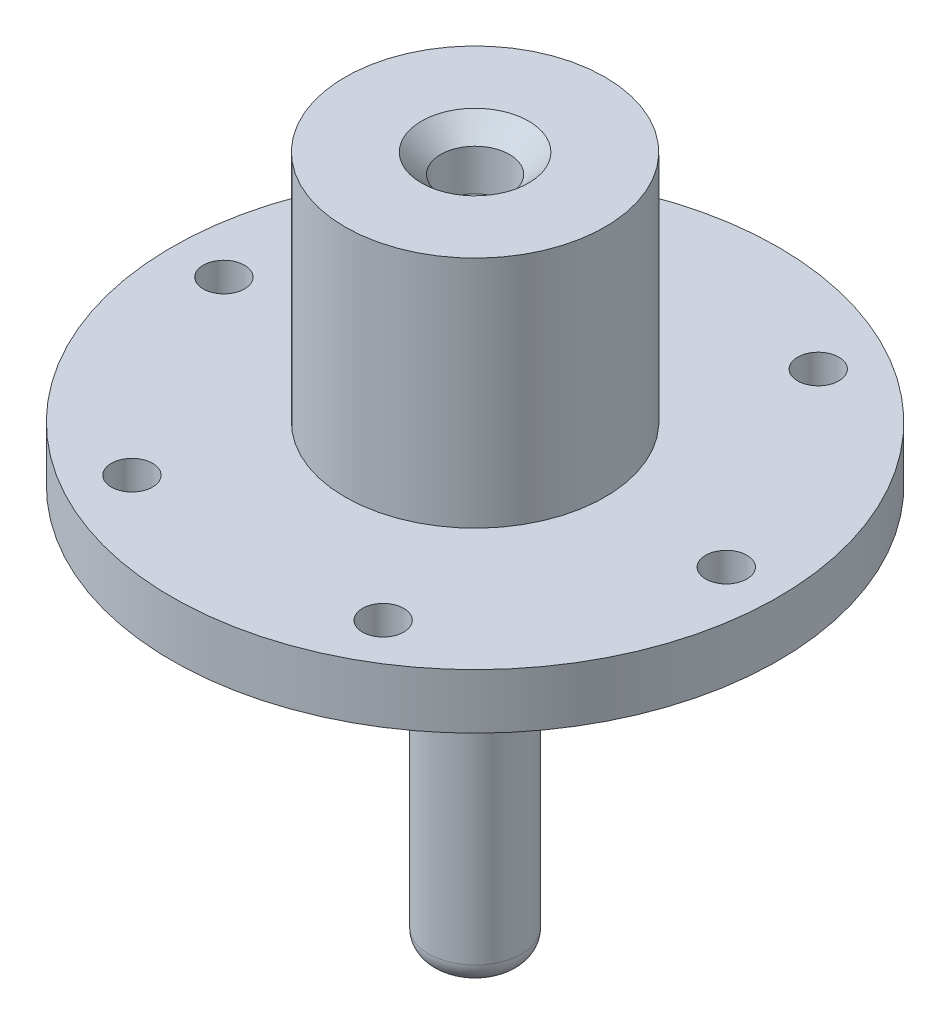
ISO-10303-21;
HEADER;
FILE_DESCRIPTION(('STEP AP214'),'2;1');
FILE_NAME('part.step','',(''),(''),'','','');
FILE_SCHEMA(('AUTOMOTIVE_DESIGN { 1 0 10303 214 1 1 1 1 }'));
ENDSEC;
DATA;
#1=APPLICATION_CONTEXT('core data for automotive mechanical design processes');
#2=APPLICATION_PROTOCOL_DEFINITION('international standard','automotive_design',2000,#1);
#3=PRODUCT_CONTEXT('',#1,'mechanical');
#4=PRODUCT('Part','Part','',(#3));
#5=PRODUCT_RELATED_PRODUCT_CATEGORY('part','',(#4));
#6=PRODUCT_DEFINITION_FORMATION('','',#4);
#7=PRODUCT_DEFINITION_CONTEXT('part definition',#1,'design');
#8=PRODUCT_DEFINITION('design','',#6,#7);
#9=PRODUCT_DEFINITION_SHAPE('','',#8);
#10=(LENGTH_UNIT() NAMED_UNIT(*) SI_UNIT(.MILLI.,.METRE.));
#11=(NAMED_UNIT(*) PLANE_ANGLE_UNIT() SI_UNIT($,.RADIAN.));
#12=(NAMED_UNIT(*) SI_UNIT($,.STERADIAN.) SOLID_ANGLE_UNIT());
#13=UNCERTAINTY_MEASURE_WITH_UNIT(LENGTH_MEASURE(1.E-05),#10,'distance_accuracy_value','');
#14=(GEOMETRIC_REPRESENTATION_CONTEXT(3) GLOBAL_UNCERTAINTY_ASSIGNED_CONTEXT((#13)) GLOBAL_UNIT_ASSIGNED_CONTEXT((#10,
#11,#12)) REPRESENTATION_CONTEXT('',''));
#15=CARTESIAN_POINT('',(0.,0.,0.));
#16=DIRECTION('',(0.,0.,1.));
#17=DIRECTION('',(1.,0.,0.));
#18=AXIS2_PLACEMENT_3D('',#15,#16,#17);
#19=CARTESIAN_POINT('',(-15.,-27.,0.));
#20=DIRECTION('',(0.,-1.,0.));
#21=DIRECTION('',(0.,0.,-1.));
#22=AXIS2_PLACEMENT_3D('',#19,#20,#21);
#23=PLANE('',#22);
#24=CARTESIAN_POINT('',(-14.4999999999998,-27.,25.1147367097489));
#25=DIRECTION('',(0.,1.,0.));
#26=DIRECTION('',(0.,0.,1.));
#27=AXIS2_PLACEMENT_3D('',#24,#25,#26);
#28=CIRCLE('',#27,2.38124999999999);
#29=CARTESIAN_POINT('',(-14.4999999999998,-27.,27.4959867097488));
#30=VERTEX_POINT('',#29);
#31=EDGE_CURVE('E132',#30,#30,#28,.T.);
#32=ORIENTED_EDGE('',*,*,#31,.F.);
#33=EDGE_LOOP('',(#32));
#34=FACE_BOUND('',#33,.T.);
#35=CARTESIAN_POINT('',(-29.,-27.,0.));
#36=DIRECTION('',(0.,1.,0.));
#37=DIRECTION('',(0.,0.,1.));
#38=AXIS2_PLACEMENT_3D('',#35,#36,#37);
#39=CIRCLE('',#38,2.38124999999999);
#40=CARTESIAN_POINT('',(-29.,-27.,2.38124999999999));
#41=VERTEX_POINT('',#40);
#42=EDGE_CURVE('E118',#41,#41,#39,.T.);
#43=ORIENTED_EDGE('',*,*,#42,.F.);
#44=EDGE_LOOP('',(#43));
#45=FACE_BOUND('',#44,.T.);
#46=CARTESIAN_POINT('',(-14.5000000000001,-27.,-25.1147367097487));
#47=DIRECTION('',(0.,1.,0.));
#48=DIRECTION('',(0.,0.,1.));
#49=AXIS2_PLACEMENT_3D('',#46,#47,#48);
#50=CIRCLE('',#49,2.38124999999999);
#51=CARTESIAN_POINT('',(-14.5000000000001,-27.,-22.7334867097487));
#52=VERTEX_POINT('',#51);
#53=EDGE_CURVE('E114',#52,#52,#50,.T.);
#54=ORIENTED_EDGE('',*,*,#53,.F.);
#55=EDGE_LOOP('',(#54));
#56=FACE_BOUND('',#55,.T.);
#57=CARTESIAN_POINT('',(14.4999999999999,-27.,-25.1147367097488));
#58=DIRECTION('',(0.,1.,0.));
#59=DIRECTION('',(0.,0.,1.));
#60=AXIS2_PLACEMENT_3D('',#57,#58,#59);
#61=CIRCLE('',#60,2.38124999999999);
#62=CARTESIAN_POINT('',(14.4999999999999,-27.,-22.7334867097488));
#63=VERTEX_POINT('',#62);
#64=EDGE_CURVE('E110',#63,#63,#61,.T.);
#65=ORIENTED_EDGE('',*,*,#64,.F.);
#66=EDGE_LOOP('',(#65));
#67=FACE_BOUND('',#66,.T.);
#68=CARTESIAN_POINT('',(29.,-27.,0.));
#69=DIRECTION('',(0.,1.,0.));
#70=DIRECTION('',(0.,0.,1.));
#71=AXIS2_PLACEMENT_3D('',#68,#69,#70);
#72=CIRCLE('',#71,2.38124999999998);
#73=CARTESIAN_POINT('',(29.,-27.,2.38124999999998));
#74=VERTEX_POINT('',#73);
#75=EDGE_CURVE('E109',#74,#74,#72,.T.);
#76=ORIENTED_EDGE('',*,*,#75,.F.);
#77=EDGE_LOOP('',(#76));
#78=FACE_BOUND('',#77,.T.);
#79=CARTESIAN_POINT('',(0.,-27.,0.));
#80=DIRECTION('',(0.,-1.,0.));
#81=DIRECTION('',(0.,0.,-1.));
#82=AXIS2_PLACEMENT_3D('',#79,#80,#81);
#83=CIRCLE('',#82,35.);
#84=CARTESIAN_POINT('',(0.,-27.,-35.));
#85=VERTEX_POINT('',#84);
#86=EDGE_CURVE('E98',#85,#85,#83,.T.);
#87=ORIENTED_EDGE('',*,*,#86,.F.);
#88=EDGE_LOOP('',(#87));
#89=FACE_BOUND('',#88,.T.);
#90=CARTESIAN_POINT('',(0.,-27.,0.));
#91=DIRECTION('',(0.,-1.,0.));
#92=DIRECTION('',(0.,0.,-1.));
#93=AXIS2_PLACEMENT_3D('',#90,#91,#92);
#94=CIRCLE('',#93,15.);
#95=CARTESIAN_POINT('',(0.,-27.,-15.));
#96=VERTEX_POINT('',#95);
#97=EDGE_CURVE('E47',#96,#96,#94,.T.);
#98=ORIENTED_EDGE('',*,*,#97,.T.);
#99=EDGE_LOOP('',(#98));
#100=FACE_BOUND('',#99,.T.);
#101=CARTESIAN_POINT('',(14.5000000000003,-27.,25.1147367097486));
#102=DIRECTION('',(0.,1.,0.));
#103=DIRECTION('',(0.,0.,1.));
#104=AXIS2_PLACEMENT_3D('',#101,#102,#103);
#105=CIRCLE('',#104,2.38124999999999);
#106=CARTESIAN_POINT('',(14.5000000000003,-27.,27.4959867097485));
#107=VERTEX_POINT('',#106);
#108=EDGE_CURVE('E281',#107,#107,#105,.T.);
#109=ORIENTED_EDGE('',*,*,#108,.F.);
#110=EDGE_LOOP('',(#109));
#111=FACE_BOUND('',#110,.T.);
#112=ADVANCED_FACE('F38',(#34,#45,#56,#67,#78,#89,#100,#111),#23,.F.);
#113=CARTESIAN_POINT('',(0.,0.,0.));
#114=DIRECTION('',(0.,-1.,0.));
#115=DIRECTION('',(0.,0.,-1.));
#116=AXIS2_PLACEMENT_3D('',#113,#114,#115);
#117=PLANE('',#116);
#118=CARTESIAN_POINT('',(0.,0.,0.));
#119=DIRECTION('',(0.,1.,0.));
#120=DIRECTION('',(0.,0.,1.));
#121=AXIS2_PLACEMENT_3D('',#118,#119,#120);
#122=CIRCLE('',#121,6.19125);
#123=CARTESIAN_POINT('',(0.,0.,6.19125));
#124=VERTEX_POINT('',#123);
#125=EDGE_CURVE('E159',#124,#124,#122,.T.);
#126=ORIENTED_EDGE('',*,*,#125,.F.);
#127=EDGE_LOOP('',(#126));
#128=FACE_BOUND('',#127,.T.);
#129=CARTESIAN_POINT('',(0.,0.,0.));
#130=DIRECTION('',(0.,-1.,0.));
#131=DIRECTION('',(0.,0.,-1.));
#132=AXIS2_PLACEMENT_3D('',#129,#130,#131);
#133=CIRCLE('',#132,15.);
#134=CARTESIAN_POINT('',(0.,0.,-15.));
#135=VERTEX_POINT('',#134);
#136=EDGE_CURVE('E11',#135,#135,#133,.T.);
#137=ORIENTED_EDGE('',*,*,#136,.F.);
#138=EDGE_LOOP('',(#137));
#139=FACE_BOUND('',#138,.T.);
#140=ADVANCED_FACE('F40',(#128,#139),#117,.F.);
#141=CARTESIAN_POINT('',(0.,-80.0033000000001,0.));
#142=DIRECTION('',(0.,-1.,0.));
#143=DIRECTION('',(0.,0.,-1.));
#144=AXIS2_PLACEMENT_3D('',#141,#142,#143);
#145=CYLINDRICAL_SURFACE('',#144,15.);
#146=ORIENTED_EDGE('',*,*,#97,.F.);
#147=EDGE_LOOP('',(#146));
#148=FACE_BOUND('',#147,.T.);
#149=ORIENTED_EDGE('',*,*,#136,.T.);
#150=EDGE_LOOP('',(#149));
#151=FACE_BOUND('',#150,.T.);
#152=ADVANCED_FACE('F190',(#148,#151),#145,.T.);
#153=CARTESIAN_POINT('',(0.,-80.0033000000001,0.));
#154=DIRECTION('',(0.,-1.,0.));
#155=DIRECTION('',(0.,0.,-1.));
#156=AXIS2_PLACEMENT_3D('',#153,#154,#155);
#157=CYLINDRICAL_SURFACE('',#156,35.);
#158=CARTESIAN_POINT('',(0.,-33.35,0.));
#159=DIRECTION('',(0.,-1.,0.));
#160=DIRECTION('',(0.,0.,-1.));
#161=AXIS2_PLACEMENT_3D('',#158,#159,#160);
#162=CIRCLE('',#161,35.);
#163=CARTESIAN_POINT('',(0.,-33.35,-35.));
#164=VERTEX_POINT('',#163);
#165=EDGE_CURVE('E94',#164,#164,#162,.T.);
#166=ORIENTED_EDGE('',*,*,#165,.F.);
#167=EDGE_LOOP('',(#166));
#168=FACE_BOUND('',#167,.T.);
#169=ORIENTED_EDGE('',*,*,#86,.T.);
#170=EDGE_LOOP('',(#169));
#171=FACE_BOUND('',#170,.T.);
#172=ADVANCED_FACE('F194',(#168,#171),#157,.T.);
#173=CARTESIAN_POINT('',(-35.,-33.35,0.));
#174=DIRECTION('',(0.,1.,0.));
#175=DIRECTION('',(0.,0.,1.));
#176=AXIS2_PLACEMENT_3D('',#173,#174,#175);
#177=PLANE('',#176);
#178=CARTESIAN_POINT('',(14.5000000000003,-33.35,25.1147367097486));
#179=DIRECTION('',(0.,1.,0.));
#180=DIRECTION('',(0.,0.,1.));
#181=AXIS2_PLACEMENT_3D('',#178,#179,#180);
#182=CIRCLE('',#181,2.38124999999999);
#183=CARTESIAN_POINT('',(14.5000000000003,-33.35,27.4959867097485));
#184=VERTEX_POINT('',#183);
#185=EDGE_CURVE('E42',#184,#184,#182,.T.);
#186=ORIENTED_EDGE('',*,*,#185,.T.);
#187=EDGE_LOOP('',(#186));
#188=FACE_BOUND('',#187,.T.);
#189=CARTESIAN_POINT('',(-14.4999999999998,-33.35,25.1147367097489));
#190=DIRECTION('',(0.,1.,0.));
#191=DIRECTION('',(0.,0.,1.));
#192=AXIS2_PLACEMENT_3D('',#189,#190,#191);
#193=CIRCLE('',#192,2.38124999999999);
#194=CARTESIAN_POINT('',(-14.4999999999998,-33.35,27.4959867097488));
#195=VERTEX_POINT('',#194);
#196=EDGE_CURVE('E126',#195,#195,#193,.T.);
#197=ORIENTED_EDGE('',*,*,#196,.T.);
#198=EDGE_LOOP('',(#197));
#199=FACE_BOUND('',#198,.T.);
#200=CARTESIAN_POINT('',(-29.,-33.35,0.));
#201=DIRECTION('',(0.,1.,0.));
#202=DIRECTION('',(0.,0.,1.));
#203=AXIS2_PLACEMENT_3D('',#200,#201,#202);
#204=CIRCLE('',#203,2.38124999999999);
#205=CARTESIAN_POINT('',(-29.,-33.35,2.38124999999999));
#206=VERTEX_POINT('',#205);
#207=EDGE_CURVE('E115',#206,#206,#204,.T.);
#208=ORIENTED_EDGE('',*,*,#207,.T.);
#209=EDGE_LOOP('',(#208));
#210=FACE_BOUND('',#209,.T.);
#211=CARTESIAN_POINT('',(-14.5000000000001,-33.35,-25.1147367097487));
#212=DIRECTION('',(0.,1.,0.));
#213=DIRECTION('',(0.,0.,1.));
#214=AXIS2_PLACEMENT_3D('',#211,#212,#213);
#215=CIRCLE('',#214,2.38124999999999);
#216=CARTESIAN_POINT('',(-14.5000000000001,-33.35,-22.7334867097487));
#217=VERTEX_POINT('',#216);
#218=EDGE_CURVE('E111',#217,#217,#215,.T.);
#219=ORIENTED_EDGE('',*,*,#218,.T.);
#220=EDGE_LOOP('',(#219));
#221=FACE_BOUND('',#220,.T.);
#222=CARTESIAN_POINT('',(14.4999999999999,-33.35,-25.1147367097488));
#223=DIRECTION('',(0.,1.,0.));
#224=DIRECTION('',(0.,0.,1.));
#225=AXIS2_PLACEMENT_3D('',#222,#223,#224);
#226=CIRCLE('',#225,2.38124999999999);
#227=CARTESIAN_POINT('',(14.4999999999999,-33.35,-22.7334867097488));
#228=VERTEX_POINT('',#227);
#229=EDGE_CURVE('E105',#228,#228,#226,.T.);
#230=ORIENTED_EDGE('',*,*,#229,.T.);
#231=EDGE_LOOP('',(#230));
#232=FACE_BOUND('',#231,.T.);
#233=CARTESIAN_POINT('',(29.,-33.35,0.));
#234=DIRECTION('',(0.,1.,0.));
#235=DIRECTION('',(0.,0.,1.));
#236=AXIS2_PLACEMENT_3D('',#233,#234,#235);
#237=CIRCLE('',#236,2.38124999999998);
#238=CARTESIAN_POINT('',(29.,-33.35,2.38124999999998));
#239=VERTEX_POINT('',#238);
#240=EDGE_CURVE('E142',#239,#239,#237,.T.);
#241=ORIENTED_EDGE('',*,*,#240,.T.);
#242=EDGE_LOOP('',(#241));
#243=FACE_BOUND('',#242,.T.);
#244=CARTESIAN_POINT('',(0.,-33.35,0.));
#245=DIRECTION('',(0.,-1.,0.));
#246=DIRECTION('',(0.,0.,-1.));
#247=AXIS2_PLACEMENT_3D('',#244,#245,#246);
#248=CIRCLE('',#247,24.);
#249=CARTESIAN_POINT('',(0.,-33.35,-24.));
#250=VERTEX_POINT('',#249);
#251=EDGE_CURVE('E151',#250,#250,#248,.T.);
#252=ORIENTED_EDGE('',*,*,#251,.F.);
#253=EDGE_LOOP('',(#252));
#254=FACE_BOUND('',#253,.T.);
#255=ORIENTED_EDGE('',*,*,#165,.T.);
#256=EDGE_LOOP('',(#255));
#257=FACE_BOUND('',#256,.T.);
#258=ADVANCED_FACE('F55',(#188,#199,#210,#221,#232,#243,#254,#257),#177,.F.);
#259=CARTESIAN_POINT('',(0.,-77.,0.));
#260=DIRECTION('',(0.,1.,0.));
#261=DIRECTION('',(0.,0.,1.));
#262=AXIS2_PLACEMENT_3D('',#259,#260,#261);
#263=CONICAL_SURFACE('',#262,3.0734,1.02974425867665);
#264=CARTESIAN_POINT('',(0.,-78.8466850265193,0.));
#265=VERTEX_POINT('',#264);
#266=VERTEX_LOOP('',#265);
#267=FACE_BOUND('',#266,.T.);
#268=CARTESIAN_POINT('',(0.,-77.,0.));
#269=DIRECTION('',(0.,1.,0.));
#270=DIRECTION('',(0.,0.,1.));
#271=AXIS2_PLACEMENT_3D('',#268,#269,#270);
#272=CIRCLE('',#271,3.0734);
#273=CARTESIAN_POINT('',(0.,-77.,3.0734));
#274=VERTEX_POINT('',#273);
#275=EDGE_CURVE('E59',#274,#274,#272,.T.);
#276=ORIENTED_EDGE('',*,*,#275,.T.);
#277=EDGE_LOOP('',(#276));
#278=FACE_BOUND('',#277,.T.);
#279=ADVANCED_FACE('F51',(#267,#278),#263,.F.);
#280=CARTESIAN_POINT('',(0.,0.,0.));
#281=DIRECTION('',(0.,1.,0.));
#282=DIRECTION('',(0.,0.,1.));
#283=AXIS2_PLACEMENT_3D('',#280,#281,#282);
#284=CYLINDRICAL_SURFACE('',#283,3.0734);
#285=ORIENTED_EDGE('',*,*,#275,.F.);
#286=EDGE_LOOP('',(#285));
#287=FACE_BOUND('',#286,.T.);
#288=CARTESIAN_POINT('',(0.,-6.89,0.));
#289=DIRECTION('',(0.,1.,0.));
#290=DIRECTION('',(0.,0.,1.));
#291=AXIS2_PLACEMENT_3D('',#288,#289,#290);
#292=CIRCLE('',#291,3.07340000000001);
#293=CARTESIAN_POINT('',(0.,-6.89,3.07340000000001));
#294=VERTEX_POINT('',#293);
#295=EDGE_CURVE('E63',#294,#294,#292,.T.);
#296=ORIENTED_EDGE('',*,*,#295,.T.);
#297=EDGE_LOOP('',(#296));
#298=FACE_BOUND('',#297,.T.);
#299=ADVANCED_FACE('F54',(#287,#298),#284,.F.);
#300=CARTESIAN_POINT('',(3.07340000000001,-6.89,0.));
#301=DIRECTION('',(0.,-1.,0.));
#302=DIRECTION('',(0.,0.,-1.));
#303=AXIS2_PLACEMENT_3D('',#300,#301,#302);
#304=PLANE('',#303);
#305=ORIENTED_EDGE('',*,*,#295,.F.);
#306=EDGE_LOOP('',(#305));
#307=FACE_BOUND('',#306,.T.);
#308=CARTESIAN_POINT('',(0.,-6.89,0.));
#309=DIRECTION('',(0.,1.,0.));
#310=DIRECTION('',(0.,0.,1.));
#311=AXIS2_PLACEMENT_3D('',#308,#309,#310);
#312=CIRCLE('',#311,3.82912199687147);
#313=CARTESIAN_POINT('',(0.,-6.89,3.82912199687147));
#314=VERTEX_POINT('',#313);
#315=EDGE_CURVE('E71',#314,#314,#312,.T.);
#316=ORIENTED_EDGE('',*,*,#315,.T.);
#317=EDGE_LOOP('',(#316));
#318=FACE_BOUND('',#317,.T.);
#319=ADVANCED_FACE('F173',(#307,#318),#304,.F.);
#320=CARTESIAN_POINT('',(0.,-2.222373,0.));
#321=DIRECTION('',(0.,1.,0.));
#322=DIRECTION('',(0.,0.,1.));
#323=AXIS2_PLACEMENT_3D('',#320,#321,#322);
#324=CONICAL_SURFACE('',#323,3.968877,0.0299323966717035);
#325=ORIENTED_EDGE('',*,*,#315,.F.);
#326=EDGE_LOOP('',(#325));
#327=FACE_BOUND('',#326,.T.);
#328=CARTESIAN_POINT('',(0.,-2.222373,0.));
#329=DIRECTION('',(0.,1.,0.));
#330=DIRECTION('',(0.,0.,1.));
#331=AXIS2_PLACEMENT_3D('',#328,#329,#330);
#332=CIRCLE('',#331,3.968877);
#333=CARTESIAN_POINT('',(0.,-2.222373,3.968877));
#334=VERTEX_POINT('',#333);
#335=EDGE_CURVE('E166',#334,#334,#332,.T.);
#336=ORIENTED_EDGE('',*,*,#335,.T.);
#337=EDGE_LOOP('',(#336));
#338=FACE_BOUND('',#337,.T.);
#339=ADVANCED_FACE('F175',(#327,#338),#324,.F.);
#340=CARTESIAN_POINT('',(0.,0.,0.));
#341=DIRECTION('',(0.,1.,0.));
#342=DIRECTION('',(0.,0.,1.));
#343=AXIS2_PLACEMENT_3D('',#340,#341,#342);
#344=CONICAL_SURFACE('',#343,6.19125,0.785398163397449);
#345=ORIENTED_EDGE('',*,*,#335,.F.);
#346=EDGE_LOOP('',(#345));
#347=FACE_BOUND('',#346,.T.);
#348=ORIENTED_EDGE('',*,*,#125,.T.);
#349=EDGE_LOOP('',(#348));
#350=FACE_BOUND('',#349,.T.);
#351=ADVANCED_FACE('F178',(#347,#350),#344,.F.);
#352=CARTESIAN_POINT('',(0.,-30.35,0.));
#353=DIRECTION('',(0.,-1.,0.));
#354=DIRECTION('',(0.,0.,-1.));
#355=AXIS2_PLACEMENT_3D('',#352,#353,#354);
#356=CYLINDRICAL_SURFACE('',#355,24.);
#357=CARTESIAN_POINT('',(0.,-30.35,0.));
#358=DIRECTION('',(0.,-1.,0.));
#359=DIRECTION('',(0.,0.,-1.));
#360=AXIS2_PLACEMENT_3D('',#357,#358,#359);
#361=CIRCLE('',#360,24.);
#362=CARTESIAN_POINT('',(0.,-30.35,-24.));
#363=VERTEX_POINT('',#362);
#364=EDGE_CURVE('E155',#363,#363,#361,.T.);
#365=ORIENTED_EDGE('',*,*,#364,.F.);
#366=EDGE_LOOP('',(#365));
#367=FACE_BOUND('',#366,.T.);
#368=ORIENTED_EDGE('',*,*,#251,.T.);
#369=EDGE_LOOP('',(#368));
#370=FACE_BOUND('',#369,.T.);
#371=ADVANCED_FACE('F184',(#367,#370),#356,.F.);
#372=CARTESIAN_POINT('',(0.,-30.35,0.));
#373=DIRECTION('',(0.,-1.,0.));
#374=DIRECTION('',(0.,0.,-1.));
#375=AXIS2_PLACEMENT_3D('',#372,#373,#374);
#376=PLANE('',#375);
#377=CARTESIAN_POINT('',(0.,-30.35,0.));
#378=DIRECTION('',(0.,-1.,0.));
#379=DIRECTION('',(0.,0.,-1.));
#380=AXIS2_PLACEMENT_3D('',#377,#378,#379);
#381=CIRCLE('',#380,21.);
#382=CARTESIAN_POINT('',(0.,-30.35,-21.));
#383=VERTEX_POINT('',#382);
#384=EDGE_CURVE('E147',#383,#383,#381,.T.);
#385=ORIENTED_EDGE('',*,*,#384,.F.);
#386=EDGE_LOOP('',(#385));
#387=FACE_BOUND('',#386,.T.);
#388=ORIENTED_EDGE('',*,*,#364,.T.);
#389=EDGE_LOOP('',(#388));
#390=FACE_BOUND('',#389,.T.);
#391=ADVANCED_FACE('F246',(#387,#390),#376,.T.);
#392=CARTESIAN_POINT('',(0.,-30.35,0.));
#393=DIRECTION('',(0.,-1.,0.));
#394=DIRECTION('',(0.,0.,-1.));
#395=AXIS2_PLACEMENT_3D('',#392,#393,#394);
#396=CYLINDRICAL_SURFACE('',#395,21.);
#397=ORIENTED_EDGE('',*,*,#384,.T.);
#398=EDGE_LOOP('',(#397));
#399=FACE_BOUND('',#398,.T.);
#400=CARTESIAN_POINT('',(0.,-33.35,0.));
#401=DIRECTION('',(0.,-1.,0.));
#402=DIRECTION('',(0.,0.,-1.));
#403=AXIS2_PLACEMENT_3D('',#400,#401,#402);
#404=CIRCLE('',#403,21.);
#405=CARTESIAN_POINT('',(0.,-33.35,-21.));
#406=VERTEX_POINT('',#405);
#407=EDGE_CURVE('E146',#406,#406,#404,.T.);
#408=ORIENTED_EDGE('',*,*,#407,.F.);
#409=EDGE_LOOP('',(#408));
#410=FACE_BOUND('',#409,.T.);
#411=ADVANCED_FACE('F236',(#399,#410),#396,.T.);
#412=CARTESIAN_POINT('',(-2.8467,-80.0033000000001,0.));
#413=DIRECTION('',(0.,1.,0.));
#414=DIRECTION('',(0.,0.,1.));
#415=AXIS2_PLACEMENT_3D('',#412,#413,#414);
#416=PLANE('',#415);
#417=CARTESIAN_POINT('',(0.,-80.0033000000001,0.));
#418=DIRECTION('',(0.,-1.,0.));
#419=DIRECTION('',(0.,0.,-1.));
#420=AXIS2_PLACEMENT_3D('',#417,#418,#419);
#421=CIRCLE('',#420,2.8467);
#422=CARTESIAN_POINT('',(0.,-80.0033000000001,-2.8467));
#423=VERTEX_POINT('',#422);
#424=EDGE_CURVE('E62',#423,#423,#421,.T.);
#425=ORIENTED_EDGE('',*,*,#424,.T.);
#426=EDGE_LOOP('',(#425));
#427=FACE_BOUND('',#426,.T.);
#428=ADVANCED_FACE('F233',(#427),#416,.F.);
#429=CARTESIAN_POINT('',(0.,-77.5033000000001,0.));
#430=DIRECTION('',(0.,-1.,0.));
#431=DIRECTION('',(0.,0.,-1.));
#432=AXIS2_PLACEMENT_3D('',#429,#430,#431);
#433=TOROIDAL_SURFACE('',#432,2.8467,2.50000000000001);
#434=ORIENTED_EDGE('',*,*,#424,.F.);
#435=EDGE_LOOP('',(#434));
#436=FACE_BOUND('',#435,.T.);
#437=CARTESIAN_POINT('',(0.,-77.5033000000001,0.));
#438=DIRECTION('',(0.,-1.,0.));
#439=DIRECTION('',(0.,0.,-1.));
#440=AXIS2_PLACEMENT_3D('',#437,#438,#439);
#441=CIRCLE('',#440,5.3467);
#442=CARTESIAN_POINT('',(0.,-77.5033000000001,-5.3467));
#443=VERTEX_POINT('',#442);
#444=EDGE_CURVE('E68',#443,#443,#441,.T.);
#445=ORIENTED_EDGE('',*,*,#444,.T.);
#446=EDGE_LOOP('',(#445));
#447=FACE_BOUND('',#446,.T.);
#448=ADVANCED_FACE('F229',(#436,#447),#433,.T.);
#449=CARTESIAN_POINT('',(0.,-80.0033000000001,0.));
#450=DIRECTION('',(0.,-1.,0.));
#451=DIRECTION('',(0.,0.,-1.));
#452=AXIS2_PLACEMENT_3D('',#449,#450,#451);
#453=CYLINDRICAL_SURFACE('',#452,5.3467);
#454=ORIENTED_EDGE('',*,*,#444,.F.);
#455=EDGE_LOOP('',(#454));
#456=FACE_BOUND('',#455,.T.);
#457=CARTESIAN_POINT('',(0.,-50.0033000000001,0.));
#458=DIRECTION('',(0.,-1.,0.));
#459=DIRECTION('',(0.,0.,-1.));
#460=AXIS2_PLACEMENT_3D('',#457,#458,#459);
#461=CIRCLE('',#460,5.3467);
#462=CARTESIAN_POINT('',(0.,-50.0033000000001,-5.3467));
#463=VERTEX_POINT('',#462);
#464=EDGE_CURVE('E78',#463,#463,#461,.T.);
#465=ORIENTED_EDGE('',*,*,#464,.T.);
#466=EDGE_LOOP('',(#465));
#467=FACE_BOUND('',#466,.T.);
#468=ADVANCED_FACE('F225',(#456,#467),#453,.T.);
#469=CARTESIAN_POINT('',(0.,-45.35,0.));
#470=DIRECTION('',(0.,1.,0.));
#471=DIRECTION('',(0.,0.,1.));
#472=AXIS2_PLACEMENT_3D('',#469,#470,#471);
#473=CONICAL_SURFACE('',#472,10.,0.785398163397444);
#474=ORIENTED_EDGE('',*,*,#464,.F.);
#475=EDGE_LOOP('',(#474));
#476=FACE_BOUND('',#475,.T.);
#477=CARTESIAN_POINT('',(0.,-45.35,0.));
#478=DIRECTION('',(0.,-1.,0.));
#479=DIRECTION('',(0.,0.,-1.));
#480=AXIS2_PLACEMENT_3D('',#477,#478,#479);
#481=CIRCLE('',#480,10.);
#482=CARTESIAN_POINT('',(0.,-45.35,-10.));
#483=VERTEX_POINT('',#482);
#484=EDGE_CURVE('E82',#483,#483,#481,.T.);
#485=ORIENTED_EDGE('',*,*,#484,.T.);
#486=EDGE_LOOP('',(#485));
#487=FACE_BOUND('',#486,.T.);
#488=ADVANCED_FACE('F221',(#476,#487),#473,.T.);
#489=CARTESIAN_POINT('',(0.,-80.0033000000001,0.));
#490=DIRECTION('',(0.,-1.,0.));
#491=DIRECTION('',(0.,0.,-1.));
#492=AXIS2_PLACEMENT_3D('',#489,#490,#491);
#493=CYLINDRICAL_SURFACE('',#492,10.);
#494=ORIENTED_EDGE('',*,*,#484,.F.);
#495=EDGE_LOOP('',(#494));
#496=FACE_BOUND('',#495,.T.);
#497=CARTESIAN_POINT('',(0.,-35.85,0.));
#498=DIRECTION('',(0.,-1.,0.));
#499=DIRECTION('',(0.,0.,-1.));
#500=AXIS2_PLACEMENT_3D('',#497,#498,#499);
#501=CIRCLE('',#500,10.);
#502=CARTESIAN_POINT('',(0.,-35.85,-10.));
#503=VERTEX_POINT('',#502);
#504=EDGE_CURVE('E86',#503,#503,#501,.T.);
#505=ORIENTED_EDGE('',*,*,#504,.T.);
#506=EDGE_LOOP('',(#505));
#507=FACE_BOUND('',#506,.T.);
#508=ADVANCED_FACE('F217',(#496,#507),#493,.T.);
#509=CARTESIAN_POINT('',(0.,-33.35,0.));
#510=DIRECTION('',(0.,1.,0.));
#511=DIRECTION('',(0.,0.,1.));
#512=AXIS2_PLACEMENT_3D('',#509,#510,#511);
#513=CONICAL_SURFACE('',#512,12.5,0.785398163397446);
#514=ORIENTED_EDGE('',*,*,#504,.F.);
#515=EDGE_LOOP('',(#514));
#516=FACE_BOUND('',#515,.T.);
#517=CARTESIAN_POINT('',(0.,-33.35,0.));
#518=DIRECTION('',(0.,-1.,0.));
#519=DIRECTION('',(0.,0.,-1.));
#520=AXIS2_PLACEMENT_3D('',#517,#518,#519);
#521=CIRCLE('',#520,12.5);
#522=CARTESIAN_POINT('',(0.,-33.35,-12.5));
#523=VERTEX_POINT('',#522);
#524=EDGE_CURVE('E90',#523,#523,#521,.T.);
#525=ORIENTED_EDGE('',*,*,#524,.T.);
#526=EDGE_LOOP('',(#525));
#527=FACE_BOUND('',#526,.T.);
#528=ADVANCED_FACE('F214',(#516,#527),#513,.T.);
#529=ORIENTED_EDGE('',*,*,#524,.F.);
#530=EDGE_LOOP('',(#529));
#531=FACE_BOUND('',#530,.T.);
#532=ORIENTED_EDGE('',*,*,#407,.T.);
#533=EDGE_LOOP('',(#532));
#534=FACE_BOUND('',#533,.T.);
#535=ADVANCED_FACE('F213',(#531,#534),#177,.F.);
#536=CARTESIAN_POINT('',(29.,-27.,0.));
#537=DIRECTION('',(0.,1.,0.));
#538=DIRECTION('',(0.,0.,1.));
#539=AXIS2_PLACEMENT_3D('',#536,#537,#538);
#540=CYLINDRICAL_SURFACE('',#539,2.38124999999998);
#541=ORIENTED_EDGE('',*,*,#75,.T.);
#542=EDGE_LOOP('',(#541));
#543=FACE_BOUND('',#542,.T.);
#544=ORIENTED_EDGE('',*,*,#240,.F.);
#545=EDGE_LOOP('',(#544));
#546=FACE_BOUND('',#545,.T.);
#547=ADVANCED_FACE('F254',(#543,#546),#540,.F.);
#548=CARTESIAN_POINT('',(14.4999999999999,-27.,-25.1147367097488));
#549=DIRECTION('',(0.,1.,0.));
#550=DIRECTION('',(0.,0.,1.));
#551=AXIS2_PLACEMENT_3D('',#548,#549,#550);
#552=CYLINDRICAL_SURFACE('',#551,2.38124999999999);
#553=ORIENTED_EDGE('',*,*,#64,.T.);
#554=EDGE_LOOP('',(#553));
#555=FACE_BOUND('',#554,.T.);
#556=ORIENTED_EDGE('',*,*,#229,.F.);
#557=EDGE_LOOP('',(#556));
#558=FACE_BOUND('',#557,.T.);
#559=ADVANCED_FACE('F257',(#555,#558),#552,.F.);
#560=CARTESIAN_POINT('',(-14.5000000000001,-27.,-25.1147367097487));
#561=DIRECTION('',(0.,1.,0.));
#562=DIRECTION('',(0.,0.,1.));
#563=AXIS2_PLACEMENT_3D('',#560,#561,#562);
#564=CYLINDRICAL_SURFACE('',#563,2.38124999999999);
#565=ORIENTED_EDGE('',*,*,#53,.T.);
#566=EDGE_LOOP('',(#565));
#567=FACE_BOUND('',#566,.T.);
#568=ORIENTED_EDGE('',*,*,#218,.F.);
#569=EDGE_LOOP('',(#568));
#570=FACE_BOUND('',#569,.T.);
#571=ADVANCED_FACE('F261',(#567,#570),#564,.F.);
#572=CARTESIAN_POINT('',(-29.,-27.,0.));
#573=DIRECTION('',(0.,1.,0.));
#574=DIRECTION('',(0.,0.,1.));
#575=AXIS2_PLACEMENT_3D('',#572,#573,#574);
#576=CYLINDRICAL_SURFACE('',#575,2.38124999999999);
#577=ORIENTED_EDGE('',*,*,#42,.T.);
#578=EDGE_LOOP('',(#577));
#579=FACE_BOUND('',#578,.T.);
#580=ORIENTED_EDGE('',*,*,#207,.F.);
#581=EDGE_LOOP('',(#580));
#582=FACE_BOUND('',#581,.T.);
#583=ADVANCED_FACE('F265',(#579,#582),#576,.F.);
#584=CARTESIAN_POINT('',(-14.4999999999998,-27.,25.1147367097489));
#585=DIRECTION('',(0.,1.,0.));
#586=DIRECTION('',(0.,0.,1.));
#587=AXIS2_PLACEMENT_3D('',#584,#585,#586);
#588=CYLINDRICAL_SURFACE('',#587,2.38124999999999);
#589=ORIENTED_EDGE('',*,*,#31,.T.);
#590=EDGE_LOOP('',(#589));
#591=FACE_BOUND('',#590,.T.);
#592=ORIENTED_EDGE('',*,*,#196,.F.);
#593=EDGE_LOOP('',(#592));
#594=FACE_BOUND('',#593,.T.);
#595=ADVANCED_FACE('F269',(#591,#594),#588,.F.);
#596=CARTESIAN_POINT('',(14.5000000000003,-27.,25.1147367097486));
#597=DIRECTION('',(0.,1.,0.));
#598=DIRECTION('',(0.,0.,1.));
#599=AXIS2_PLACEMENT_3D('',#596,#597,#598);
#600=CYLINDRICAL_SURFACE('',#599,2.38124999999999);
#601=ORIENTED_EDGE('',*,*,#108,.T.);
#602=EDGE_LOOP('',(#601));
#603=FACE_BOUND('',#602,.T.);
#604=ORIENTED_EDGE('',*,*,#185,.F.);
#605=EDGE_LOOP('',(#604));
#606=FACE_BOUND('',#605,.T.);
#607=ADVANCED_FACE('F272',(#603,#606),#600,.F.);
#608=CLOSED_SHELL('',(#112,#140,#152,#172,#258,#279,#299,#319,#339,#351,#371,#391,#411,#428,
#448,#468,#488,#508,#528,#535,#547,#559,#571,#583,#595,#607));
#609=MANIFOLD_SOLID_BREP('B2',#608);
#610=ADVANCED_BREP_SHAPE_REPRESENTATION('',(#18,#609),#14);
#611=SHAPE_DEFINITION_REPRESENTATION(#9,#610);
ENDSEC;
END-ISO-10303-21;
